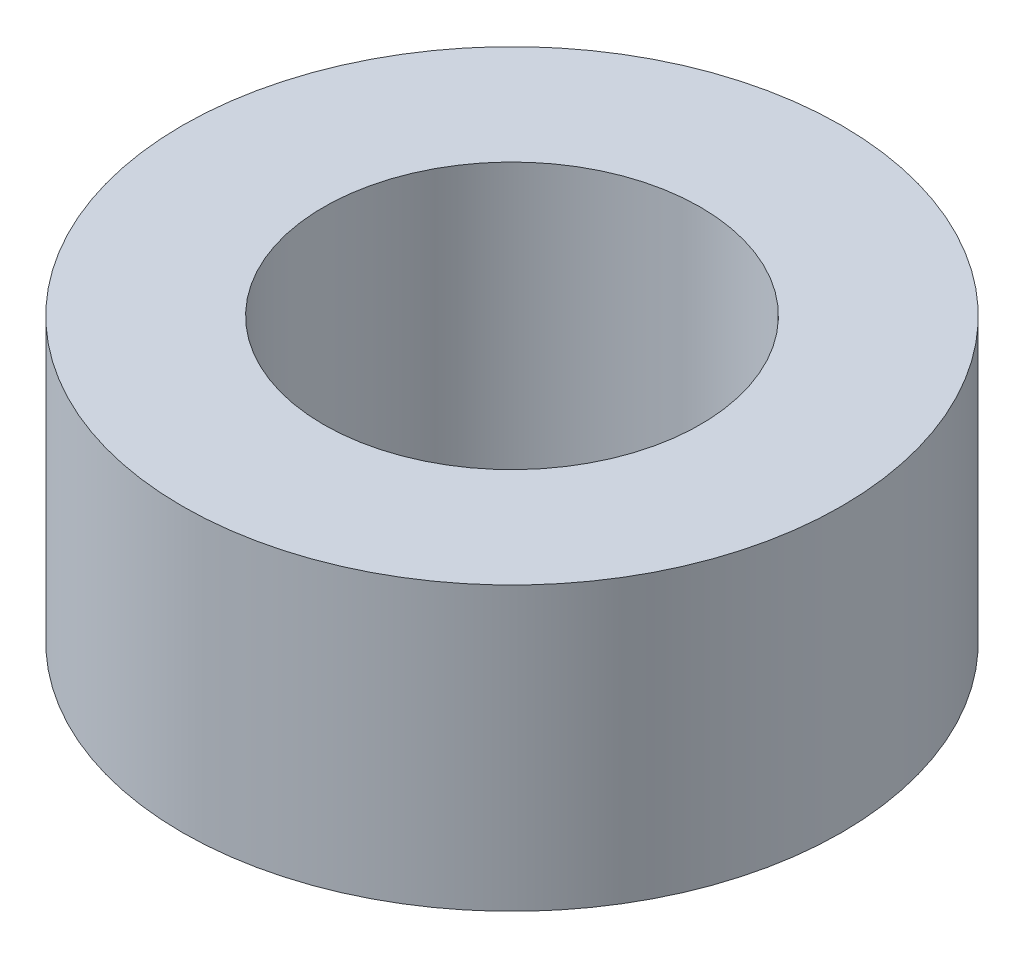
ISO-10303-21;
HEADER;
FILE_DESCRIPTION(('STEP AP214'),'2;1');
FILE_NAME('part.step','',(''),(''),'','','');
FILE_SCHEMA(('AUTOMOTIVE_DESIGN { 1 0 10303 214 1 1 1 1 }'));
ENDSEC;
DATA;
#1=APPLICATION_CONTEXT('core data for automotive mechanical design processes');
#2=APPLICATION_PROTOCOL_DEFINITION('international standard','automotive_design',2000,#1);
#3=PRODUCT_CONTEXT('',#1,'mechanical');
#4=PRODUCT('Part','Part','',(#3));
#5=PRODUCT_RELATED_PRODUCT_CATEGORY('part','',(#4));
#6=PRODUCT_DEFINITION_FORMATION('','',#4);
#7=PRODUCT_DEFINITION_CONTEXT('part definition',#1,'design');
#8=PRODUCT_DEFINITION('design','',#6,#7);
#9=PRODUCT_DEFINITION_SHAPE('','',#8);
#10=(LENGTH_UNIT() NAMED_UNIT(*) SI_UNIT(.MILLI.,.METRE.));
#11=(NAMED_UNIT(*) PLANE_ANGLE_UNIT() SI_UNIT($,.RADIAN.));
#12=(NAMED_UNIT(*) SI_UNIT($,.STERADIAN.) SOLID_ANGLE_UNIT());
#13=UNCERTAINTY_MEASURE_WITH_UNIT(LENGTH_MEASURE(1.E-05),#10,'distance_accuracy_value','');
#14=(GEOMETRIC_REPRESENTATION_CONTEXT(3) GLOBAL_UNCERTAINTY_ASSIGNED_CONTEXT((#13)) GLOBAL_UNIT_ASSIGNED_CONTEXT((#10,
#11,#12)) REPRESENTATION_CONTEXT('',''));
#15=CARTESIAN_POINT('',(0.,0.,0.));
#16=DIRECTION('',(0.,0.,1.));
#17=DIRECTION('',(1.,0.,0.));
#18=AXIS2_PLACEMENT_3D('',#15,#16,#17);
#19=CARTESIAN_POINT('',(0.,3.,0.));
#20=DIRECTION('',(0.,1.,0.));
#21=DIRECTION('',(0.,0.,1.));
#22=AXIS2_PLACEMENT_3D('',#19,#20,#21);
#23=PLANE('',#22);
#24=CARTESIAN_POINT('',(0.,3.,0.));
#25=DIRECTION('',(0.,1.,0.));
#26=DIRECTION('',(0.,0.,1.));
#27=AXIS2_PLACEMENT_3D('',#24,#25,#26);
#28=CIRCLE('',#27,3.5);
#29=CARTESIAN_POINT('',(0.,3.,3.5));
#30=VERTEX_POINT('',#29);
#31=EDGE_CURVE('E10',#30,#30,#28,.T.);
#32=ORIENTED_EDGE('',*,*,#31,.T.);
#33=EDGE_LOOP('',(#32));
#34=FACE_BOUND('',#33,.T.);
#35=CARTESIAN_POINT('',(0.,3.,0.));
#36=DIRECTION('',(0.,1.,0.));
#37=DIRECTION('',(0.,0.,1.));
#38=AXIS2_PLACEMENT_3D('',#35,#36,#37);
#39=CIRCLE('',#38,2.);
#40=CARTESIAN_POINT('',(0.,3.,2.));
#41=VERTEX_POINT('',#40);
#42=EDGE_CURVE('E48',#41,#41,#39,.T.);
#43=ORIENTED_EDGE('',*,*,#42,.F.);
#44=EDGE_LOOP('',(#43));
#45=FACE_BOUND('',#44,.T.);
#46=ADVANCED_FACE('F37',(#34,#45),#23,.T.);
#47=CARTESIAN_POINT('',(0.,0.,0.));
#48=DIRECTION('',(0.,1.,0.));
#49=DIRECTION('',(0.,0.,1.));
#50=AXIS2_PLACEMENT_3D('',#47,#48,#49);
#51=PLANE('',#50);
#52=CARTESIAN_POINT('',(0.,0.,0.));
#53=DIRECTION('',(0.,1.,0.));
#54=DIRECTION('',(0.,0.,1.));
#55=AXIS2_PLACEMENT_3D('',#52,#53,#54);
#56=CIRCLE('',#55,3.5);
#57=CARTESIAN_POINT('',(0.,0.,3.5));
#58=VERTEX_POINT('',#57);
#59=EDGE_CURVE('E41',#58,#58,#56,.T.);
#60=ORIENTED_EDGE('',*,*,#59,.F.);
#61=EDGE_LOOP('',(#60));
#62=FACE_BOUND('',#61,.T.);
#63=CARTESIAN_POINT('',(0.,0.,0.));
#64=DIRECTION('',(0.,1.,0.));
#65=DIRECTION('',(0.,0.,1.));
#66=AXIS2_PLACEMENT_3D('',#63,#64,#65);
#67=CIRCLE('',#66,2.);
#68=CARTESIAN_POINT('',(0.,0.,2.));
#69=VERTEX_POINT('',#68);
#70=EDGE_CURVE('E50',#69,#69,#67,.T.);
#71=ORIENTED_EDGE('',*,*,#70,.T.);
#72=EDGE_LOOP('',(#71));
#73=FACE_BOUND('',#72,.T.);
#74=ADVANCED_FACE('F60',(#62,#73),#51,.F.);
#75=CARTESIAN_POINT('',(0.,3.,0.));
#76=DIRECTION('',(0.,-1.,0.));
#77=DIRECTION('',(0.,0.,-1.));
#78=AXIS2_PLACEMENT_3D('',#75,#76,#77);
#79=CYLINDRICAL_SURFACE('',#78,3.5);
#80=ORIENTED_EDGE('',*,*,#31,.F.);
#81=EDGE_LOOP('',(#80));
#82=FACE_BOUND('',#81,.T.);
#83=ORIENTED_EDGE('',*,*,#59,.T.);
#84=EDGE_LOOP('',(#83));
#85=FACE_BOUND('',#84,.T.);
#86=ADVANCED_FACE('F39',(#82,#85),#79,.T.);
#87=CARTESIAN_POINT('',(0.,3.,0.));
#88=DIRECTION('',(0.,-1.,0.));
#89=DIRECTION('',(0.,0.,-1.));
#90=AXIS2_PLACEMENT_3D('',#87,#88,#89);
#91=CYLINDRICAL_SURFACE('',#90,2.);
#92=ORIENTED_EDGE('',*,*,#42,.T.);
#93=EDGE_LOOP('',(#92));
#94=FACE_BOUND('',#93,.T.);
#95=ORIENTED_EDGE('',*,*,#70,.F.);
#96=EDGE_LOOP('',(#95));
#97=FACE_BOUND('',#96,.T.);
#98=ADVANCED_FACE('F56',(#94,#97),#91,.F.);
#99=CLOSED_SHELL('',(#46,#74,#86,#98));
#100=MANIFOLD_SOLID_BREP('B2',#99);
#101=ADVANCED_BREP_SHAPE_REPRESENTATION('',(#18,#100),#14);
#102=SHAPE_DEFINITION_REPRESENTATION(#9,#101);
ENDSEC;
END-ISO-10303-21;
